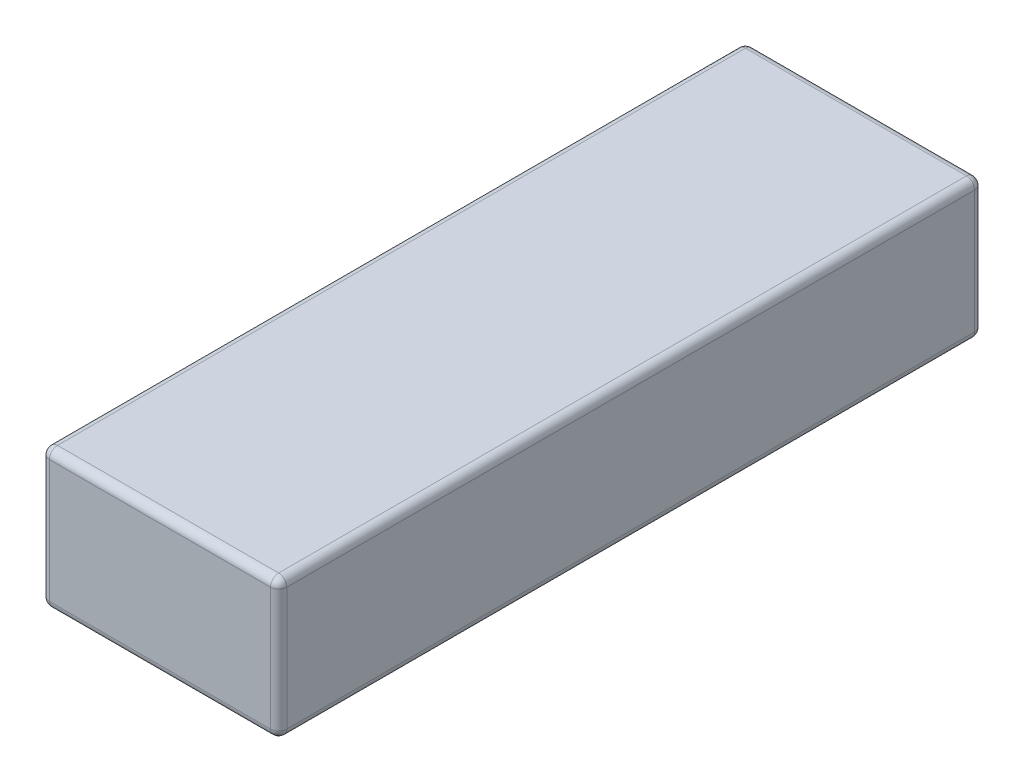
ISO-10303-21;
HEADER;
FILE_DESCRIPTION(('STEP AP214'),'2;1');
FILE_NAME('part.step','',(''),(''),'','','');
FILE_SCHEMA(('AUTOMOTIVE_DESIGN { 1 0 10303 214 1 1 1 1 }'));
ENDSEC;
DATA;
#1=APPLICATION_CONTEXT('core data for automotive mechanical design processes');
#2=APPLICATION_PROTOCOL_DEFINITION('international standard','automotive_design',2000,#1);
#3=PRODUCT_CONTEXT('',#1,'mechanical');
#4=PRODUCT('Part','Part','',(#3));
#5=PRODUCT_RELATED_PRODUCT_CATEGORY('part','',(#4));
#6=PRODUCT_DEFINITION_FORMATION('','',#4);
#7=PRODUCT_DEFINITION_CONTEXT('part definition',#1,'design');
#8=PRODUCT_DEFINITION('design','',#6,#7);
#9=PRODUCT_DEFINITION_SHAPE('','',#8);
#10=(LENGTH_UNIT() NAMED_UNIT(*) SI_UNIT(.MILLI.,.METRE.));
#11=(NAMED_UNIT(*) PLANE_ANGLE_UNIT() SI_UNIT($,.RADIAN.));
#12=(NAMED_UNIT(*) SI_UNIT($,.STERADIAN.) SOLID_ANGLE_UNIT());
#13=UNCERTAINTY_MEASURE_WITH_UNIT(LENGTH_MEASURE(1.E-05),#10,'distance_accuracy_value','');
#14=(GEOMETRIC_REPRESENTATION_CONTEXT(3) GLOBAL_UNCERTAINTY_ASSIGNED_CONTEXT((#13)) GLOBAL_UNIT_ASSIGNED_CONTEXT((#10,
#11,#12)) REPRESENTATION_CONTEXT('',''));
#15=CARTESIAN_POINT('',(0.,0.,0.));
#16=DIRECTION('',(0.,0.,1.));
#17=DIRECTION('',(1.,0.,0.));
#18=AXIS2_PLACEMENT_3D('',#15,#16,#17);
#19=CARTESIAN_POINT('',(14.5,-8.5,86.));
#20=DIRECTION('',(-1.,0.,0.));
#21=DIRECTION('',(0.,0.,1.));
#22=AXIS2_PLACEMENT_3D('',#19,#20,#21);
#23=PLANE('',#22);
#24=DIRECTION('',(0.,0.,-1.));
#25=VECTOR('',#24,1.);
#26=CARTESIAN_POINT('',(14.5,7.5,86.));
#27=LINE('',#26,#25);
#28=CARTESIAN_POINT('',(14.5,7.5,1.));
#29=VERTEX_POINT('',#28);
#30=CARTESIAN_POINT('',(14.5,7.5,85.));
#31=VERTEX_POINT('',#30);
#32=EDGE_CURVE('E192',#29,#31,#27,.F.);
#33=ORIENTED_EDGE('',*,*,#32,.T.);
#34=DIRECTION('',(0.,1.,0.));
#35=VECTOR('',#34,1.);
#36=CARTESIAN_POINT('',(14.5,-8.5,85.));
#37=LINE('',#36,#35);
#38=CARTESIAN_POINT('',(14.5,-7.5,85.));
#39=VERTEX_POINT('',#38);
#40=EDGE_CURVE('E199',#31,#39,#37,.F.);
#41=ORIENTED_EDGE('',*,*,#40,.T.);
#42=DIRECTION('',(0.,0.,-1.));
#43=VECTOR('',#42,1.);
#44=CARTESIAN_POINT('',(14.5,-7.5,86.));
#45=LINE('',#44,#43);
#46=CARTESIAN_POINT('',(14.5,-7.5,1.));
#47=VERTEX_POINT('',#46);
#48=EDGE_CURVE('E195',#39,#47,#45,.T.);
#49=ORIENTED_EDGE('',*,*,#48,.T.);
#50=DIRECTION('',(0.,1.,0.));
#51=VECTOR('',#50,1.);
#52=CARTESIAN_POINT('',(14.5,8.5,1.));
#53=LINE('',#52,#51);
#54=EDGE_CURVE('E189',#47,#29,#53,.T.);
#55=ORIENTED_EDGE('',*,*,#54,.T.);
#56=EDGE_LOOP('',(#33,#41,#49,#55));
#57=FACE_BOUND('',#56,.T.);
#58=ADVANCED_FACE('F44',(#57),#23,.F.);
#59=CARTESIAN_POINT('',(-14.5,8.5,86.));
#60=DIRECTION('',(0.,-1.,0.));
#61=DIRECTION('',(0.,0.,-1.));
#62=AXIS2_PLACEMENT_3D('',#59,#60,#61);
#63=PLANE('',#62);
#64=DIRECTION('',(-1.,0.,0.));
#65=VECTOR('',#64,1.);
#66=CARTESIAN_POINT('',(-14.5,8.5,85.));
#67=LINE('',#66,#65);
#68=CARTESIAN_POINT('',(-13.5,8.5,85.));
#69=VERTEX_POINT('',#68);
#70=CARTESIAN_POINT('',(13.5,8.5,85.));
#71=VERTEX_POINT('',#70);
#72=EDGE_CURVE('E208',#69,#71,#67,.F.);
#73=ORIENTED_EDGE('',*,*,#72,.T.);
#74=DIRECTION('',(0.,0.,-1.));
#75=VECTOR('',#74,1.);
#76=CARTESIAN_POINT('',(13.5,8.5,86.));
#77=LINE('',#76,#75);
#78=CARTESIAN_POINT('',(13.5,8.5,1.));
#79=VERTEX_POINT('',#78);
#80=EDGE_CURVE('E211',#71,#79,#77,.T.);
#81=ORIENTED_EDGE('',*,*,#80,.T.);
#82=DIRECTION('',(-1.,0.,0.));
#83=VECTOR('',#82,1.);
#84=CARTESIAN_POINT('',(-14.5,8.5,1.));
#85=LINE('',#84,#83);
#86=CARTESIAN_POINT('',(-13.5,8.5,1.));
#87=VERTEX_POINT('',#86);
#88=EDGE_CURVE('E205',#79,#87,#85,.T.);
#89=ORIENTED_EDGE('',*,*,#88,.T.);
#90=DIRECTION('',(0.,0.,-1.));
#91=VECTOR('',#90,1.);
#92=CARTESIAN_POINT('',(-13.5,8.5,86.));
#93=LINE('',#92,#91);
#94=EDGE_CURVE('E202',#87,#69,#93,.F.);
#95=ORIENTED_EDGE('',*,*,#94,.T.);
#96=EDGE_LOOP('',(#73,#81,#89,#95));
#97=FACE_BOUND('',#96,.T.);
#98=ADVANCED_FACE('F353',(#97),#63,.F.);
#99=CARTESIAN_POINT('',(-14.5,-8.5,86.));
#100=DIRECTION('',(1.,0.,0.));
#101=DIRECTION('',(0.,0.,-1.));
#102=AXIS2_PLACEMENT_3D('',#99,#100,#101);
#103=PLANE('',#102);
#104=DIRECTION('',(0.,-1.,0.));
#105=VECTOR('',#104,1.);
#106=CARTESIAN_POINT('',(-14.5,-8.5,1.));
#107=LINE('',#106,#105);
#108=CARTESIAN_POINT('',(-14.5,7.5,1.));
#109=VERTEX_POINT('',#108);
#110=CARTESIAN_POINT('',(-14.5,-7.5,1.));
#111=VERTEX_POINT('',#110);
#112=EDGE_CURVE('E181',#109,#111,#107,.T.);
#113=ORIENTED_EDGE('',*,*,#112,.T.);
#114=DIRECTION('',(0.,0.,-1.));
#115=VECTOR('',#114,1.);
#116=CARTESIAN_POINT('',(-14.5,-7.5,86.));
#117=LINE('',#116,#115);
#118=CARTESIAN_POINT('',(-14.5,-7.5,85.));
#119=VERTEX_POINT('',#118);
#120=EDGE_CURVE('E140',#111,#119,#117,.F.);
#121=ORIENTED_EDGE('',*,*,#120,.T.);
#122=DIRECTION('',(0.,-1.,0.));
#123=VECTOR('',#122,1.);
#124=CARTESIAN_POINT('',(-14.5,-8.5,85.));
#125=LINE('',#124,#123);
#126=CARTESIAN_POINT('',(-14.5,7.5,85.));
#127=VERTEX_POINT('',#126);
#128=EDGE_CURVE('E184',#119,#127,#125,.F.);
#129=ORIENTED_EDGE('',*,*,#128,.T.);
#130=DIRECTION('',(0.,0.,-1.));
#131=VECTOR('',#130,1.);
#132=CARTESIAN_POINT('',(-14.5,7.5,86.));
#133=LINE('',#132,#131);
#134=EDGE_CURVE('E175',#127,#109,#133,.T.);
#135=ORIENTED_EDGE('',*,*,#134,.T.);
#136=EDGE_LOOP('',(#113,#121,#129,#135));
#137=FACE_BOUND('',#136,.T.);
#138=ADVANCED_FACE('F369',(#137),#103,.F.);
#139=CARTESIAN_POINT('',(-14.5,-8.5,86.));
#140=DIRECTION('',(0.,1.,0.));
#141=DIRECTION('',(0.,0.,1.));
#142=AXIS2_PLACEMENT_3D('',#139,#140,#141);
#143=PLANE('',#142);
#144=DIRECTION('',(0.,0.,-1.));
#145=VECTOR('',#144,1.);
#146=CARTESIAN_POINT('',(13.5,-8.5,86.));
#147=LINE('',#146,#145);
#148=CARTESIAN_POINT('',(13.5,-8.5,1.));
#149=VERTEX_POINT('',#148);
#150=CARTESIAN_POINT('',(13.5,-8.5,85.));
#151=VERTEX_POINT('',#150);
#152=EDGE_CURVE('E164',#149,#151,#147,.F.);
#153=ORIENTED_EDGE('',*,*,#152,.T.);
#154=DIRECTION('',(1.,0.,0.));
#155=VECTOR('',#154,1.);
#156=CARTESIAN_POINT('',(-14.5,-8.5,85.));
#157=LINE('',#156,#155);
#158=CARTESIAN_POINT('',(-13.5,-8.5,85.));
#159=VERTEX_POINT('',#158);
#160=EDGE_CURVE('E168',#151,#159,#157,.F.);
#161=ORIENTED_EDGE('',*,*,#160,.T.);
#162=DIRECTION('',(0.,0.,-1.));
#163=VECTOR('',#162,1.);
#164=CARTESIAN_POINT('',(-13.5,-8.5,86.));
#165=LINE('',#164,#163);
#166=CARTESIAN_POINT('',(-13.5,-8.5,1.));
#167=VERTEX_POINT('',#166);
#168=EDGE_CURVE('E138',#159,#167,#165,.T.);
#169=ORIENTED_EDGE('',*,*,#168,.T.);
#170=DIRECTION('',(1.,0.,0.));
#171=VECTOR('',#170,1.);
#172=CARTESIAN_POINT('',(14.5,-8.5,1.));
#173=LINE('',#172,#171);
#174=EDGE_CURVE('E157',#167,#149,#173,.T.);
#175=ORIENTED_EDGE('',*,*,#174,.T.);
#176=EDGE_LOOP('',(#153,#161,#169,#175));
#177=FACE_BOUND('',#176,.T.);
#178=ADVANCED_FACE('F166',(#177),#143,.F.);
#179=CARTESIAN_POINT('',(0.,0.,86.));
#180=DIRECTION('',(0.,0.,-1.));
#181=DIRECTION('',(-1.,0.,0.));
#182=AXIS2_PLACEMENT_3D('',#179,#180,#181);
#183=PLANE('',#182);
#184=DIRECTION('',(0.,-1.,0.));
#185=VECTOR('',#184,1.);
#186=CARTESIAN_POINT('',(-13.5,0.,86.));
#187=LINE('',#186,#185);
#188=CARTESIAN_POINT('',(-13.5,7.5,86.));
#189=VERTEX_POINT('',#188);
#190=CARTESIAN_POINT('',(-13.5,-7.5,86.));
#191=VERTEX_POINT('',#190);
#192=EDGE_CURVE('E221',#189,#191,#187,.T.);
#193=ORIENTED_EDGE('',*,*,#192,.T.);
#194=DIRECTION('',(1.,0.,0.));
#195=VECTOR('',#194,1.);
#196=CARTESIAN_POINT('',(0.,-7.5,86.));
#197=LINE('',#196,#195);
#198=CARTESIAN_POINT('',(13.5,-7.5,86.));
#199=VERTEX_POINT('',#198);
#200=EDGE_CURVE('E224',#191,#199,#197,.T.);
#201=ORIENTED_EDGE('',*,*,#200,.T.);
#202=DIRECTION('',(0.,1.,0.));
#203=VECTOR('',#202,1.);
#204=CARTESIAN_POINT('',(13.5,0.,86.));
#205=LINE('',#204,#203);
#206=CARTESIAN_POINT('',(13.5,7.5,86.));
#207=VERTEX_POINT('',#206);
#208=EDGE_CURVE('E215',#199,#207,#205,.T.);
#209=ORIENTED_EDGE('',*,*,#208,.T.);
#210=DIRECTION('',(-1.,0.,0.));
#211=VECTOR('',#210,1.);
#212=CARTESIAN_POINT('',(0.,7.5,86.));
#213=LINE('',#212,#211);
#214=EDGE_CURVE('E218',#207,#189,#213,.T.);
#215=ORIENTED_EDGE('',*,*,#214,.T.);
#216=EDGE_LOOP('',(#193,#201,#209,#215));
#217=FACE_BOUND('',#216,.T.);
#218=ADVANCED_FACE('F333',(#217),#183,.F.);
#219=CARTESIAN_POINT('',(0.,0.,0.));
#220=DIRECTION('',(0.,0.,-1.));
#221=DIRECTION('',(-1.,0.,0.));
#222=AXIS2_PLACEMENT_3D('',#219,#220,#221);
#223=PLANE('',#222);
#224=DIRECTION('',(0.,-1.,0.));
#225=VECTOR('',#224,1.);
#226=CARTESIAN_POINT('',(-13.5,8.5,0.));
#227=LINE('',#226,#225);
#228=CARTESIAN_POINT('',(-13.5,-7.5,0.));
#229=VERTEX_POINT('',#228);
#230=CARTESIAN_POINT('',(-13.5,7.5,0.));
#231=VERTEX_POINT('',#230);
#232=EDGE_CURVE('E54',#229,#231,#227,.F.);
#233=ORIENTED_EDGE('',*,*,#232,.T.);
#234=DIRECTION('',(-1.,0.,0.));
#235=VECTOR('',#234,1.);
#236=CARTESIAN_POINT('',(14.5,7.5,0.));
#237=LINE('',#236,#235);
#238=CARTESIAN_POINT('',(13.5,7.5,0.));
#239=VERTEX_POINT('',#238);
#240=EDGE_CURVE('E11',#231,#239,#237,.F.);
#241=ORIENTED_EDGE('',*,*,#240,.T.);
#242=DIRECTION('',(0.,1.,0.));
#243=VECTOR('',#242,1.);
#244=CARTESIAN_POINT('',(13.5,-8.5,0.));
#245=LINE('',#244,#243);
#246=CARTESIAN_POINT('',(13.5,-7.5,0.));
#247=VERTEX_POINT('',#246);
#248=EDGE_CURVE('E228',#239,#247,#245,.F.);
#249=ORIENTED_EDGE('',*,*,#248,.T.);
#250=DIRECTION('',(1.,0.,0.));
#251=VECTOR('',#250,1.);
#252=CARTESIAN_POINT('',(-14.5,-7.5,0.));
#253=LINE('',#252,#251);
#254=EDGE_CURVE('E65',#247,#229,#253,.F.);
#255=ORIENTED_EDGE('',*,*,#254,.T.);
#256=EDGE_LOOP('',(#233,#241,#249,#255));
#257=FACE_BOUND('',#256,.T.);
#258=ADVANCED_FACE('F578',(#257),#223,.T.);
#259=CARTESIAN_POINT('',(13.5,7.5,86.));
#260=DIRECTION('',(0.,0.,-1.));
#261=DIRECTION('',(-1.,0.,0.));
#262=AXIS2_PLACEMENT_3D('',#259,#260,#261);
#263=CYLINDRICAL_SURFACE('',#262,1.);
#264=CARTESIAN_POINT('',(13.5,7.5,85.));
#265=DIRECTION('',(0.,0.,1.));
#266=DIRECTION('',(1.,0.,0.));
#267=AXIS2_PLACEMENT_3D('',#264,#265,#266);
#268=CIRCLE('',#267,1.);
#269=EDGE_CURVE('E48',#31,#71,#268,.T.);
#270=ORIENTED_EDGE('',*,*,#269,.F.);
#271=ORIENTED_EDGE('',*,*,#32,.F.);
#272=CARTESIAN_POINT('',(13.5,7.5,1.));
#273=DIRECTION('',(0.,0.,-1.));
#274=DIRECTION('',(-1.,0.,0.));
#275=AXIS2_PLACEMENT_3D('',#272,#273,#274);
#276=CIRCLE('',#275,1.);
#277=EDGE_CURVE('E305',#79,#29,#276,.T.);
#278=ORIENTED_EDGE('',*,*,#277,.F.);
#279=ORIENTED_EDGE('',*,*,#80,.F.);
#280=EDGE_LOOP('',(#270,#271,#278,#279));
#281=FACE_BOUND('',#280,.T.);
#282=ADVANCED_FACE('F46',(#281),#263,.T.);
#283=CARTESIAN_POINT('',(13.5,7.5,85.));
#284=DIRECTION('',(0.,1.,0.));
#285=DIRECTION('',(-1.,0.,0.));
#286=AXIS2_PLACEMENT_3D('',#283,#284,#285);
#287=SPHERICAL_SURFACE('',#286,1.);
#288=CARTESIAN_POINT('',(13.5,7.5,85.));
#289=DIRECTION('',(0.,1.,0.));
#290=DIRECTION('',(0.,0.,1.));
#291=AXIS2_PLACEMENT_3D('',#288,#289,#290);
#292=CIRCLE('',#291,1.);
#293=EDGE_CURVE('E298',#31,#207,#292,.F.);
#294=ORIENTED_EDGE('',*,*,#293,.F.);
#295=ORIENTED_EDGE('',*,*,#269,.T.);
#296=CARTESIAN_POINT('',(13.5,7.5,85.));
#297=DIRECTION('',(1.,0.,0.));
#298=DIRECTION('',(0.,0.,-1.));
#299=AXIS2_PLACEMENT_3D('',#296,#297,#298);
#300=CIRCLE('',#299,1.);
#301=EDGE_CURVE('E302',#207,#71,#300,.F.);
#302=ORIENTED_EDGE('',*,*,#301,.F.);
#303=EDGE_LOOP('',(#294,#295,#302));
#304=FACE_BOUND('',#303,.T.);
#305=ADVANCED_FACE('F320',(#304),#287,.T.);
#306=CARTESIAN_POINT('',(13.5,7.5,1.));
#307=DIRECTION('',(1.,0.,0.));
#308=DIRECTION('',(0.,0.,-1.));
#309=AXIS2_PLACEMENT_3D('',#306,#307,#308);
#310=SPHERICAL_SURFACE('',#309,1.);
#311=CARTESIAN_POINT('',(13.5,7.5,1.));
#312=DIRECTION('',(1.,0.,0.));
#313=DIRECTION('',(0.,1.,0.));
#314=AXIS2_PLACEMENT_3D('',#311,#312,#313);
#315=CIRCLE('',#314,1.);
#316=EDGE_CURVE('E290',#79,#239,#315,.F.);
#317=ORIENTED_EDGE('',*,*,#316,.F.);
#318=ORIENTED_EDGE('',*,*,#277,.T.);
#319=CARTESIAN_POINT('',(13.5,7.5,1.));
#320=DIRECTION('',(0.,1.,0.));
#321=DIRECTION('',(0.,0.,1.));
#322=AXIS2_PLACEMENT_3D('',#319,#320,#321);
#323=CIRCLE('',#322,1.);
#324=EDGE_CURVE('E294',#239,#29,#323,.F.);
#325=ORIENTED_EDGE('',*,*,#324,.F.);
#326=EDGE_LOOP('',(#317,#318,#325));
#327=FACE_BOUND('',#326,.T.);
#328=ADVANCED_FACE('F551',(#327),#310,.T.);
#329=CARTESIAN_POINT('',(0.,7.5,85.));
#330=DIRECTION('',(-1.,0.,0.));
#331=DIRECTION('',(0.,0.,1.));
#332=AXIS2_PLACEMENT_3D('',#329,#330,#331);
#333=CYLINDRICAL_SURFACE('',#332,1.);
#334=ORIENTED_EDGE('',*,*,#301,.T.);
#335=ORIENTED_EDGE('',*,*,#72,.F.);
#336=CARTESIAN_POINT('',(-13.5,7.5,85.));
#337=DIRECTION('',(-1.,0.,0.));
#338=DIRECTION('',(0.,0.,1.));
#339=AXIS2_PLACEMENT_3D('',#336,#337,#338);
#340=CIRCLE('',#339,1.);
#341=EDGE_CURVE('E282',#189,#69,#340,.T.);
#342=ORIENTED_EDGE('',*,*,#341,.F.);
#343=ORIENTED_EDGE('',*,*,#214,.F.);
#344=EDGE_LOOP('',(#334,#335,#342,#343));
#345=FACE_BOUND('',#344,.T.);
#346=ADVANCED_FACE('F328',(#345),#333,.T.);
#347=CARTESIAN_POINT('',(13.5,0.,85.));
#348=DIRECTION('',(0.,1.,0.));
#349=DIRECTION('',(0.,0.,1.));
#350=AXIS2_PLACEMENT_3D('',#347,#348,#349);
#351=CYLINDRICAL_SURFACE('',#350,1.);
#352=ORIENTED_EDGE('',*,*,#293,.T.);
#353=ORIENTED_EDGE('',*,*,#208,.F.);
#354=CARTESIAN_POINT('',(13.5,-7.5,85.));
#355=DIRECTION('',(0.,-1.,0.));
#356=DIRECTION('',(0.,0.,-1.));
#357=AXIS2_PLACEMENT_3D('',#354,#355,#356);
#358=CIRCLE('',#357,1.);
#359=EDGE_CURVE('E278',#39,#199,#358,.T.);
#360=ORIENTED_EDGE('',*,*,#359,.F.);
#361=ORIENTED_EDGE('',*,*,#40,.F.);
#362=EDGE_LOOP('',(#352,#353,#360,#361));
#363=FACE_BOUND('',#362,.T.);
#364=ADVANCED_FACE('F339',(#363),#351,.T.);
#365=CARTESIAN_POINT('',(13.5,-7.5,86.));
#366=DIRECTION('',(0.,0.,-1.));
#367=DIRECTION('',(-1.,0.,0.));
#368=AXIS2_PLACEMENT_3D('',#365,#366,#367);
#369=CYLINDRICAL_SURFACE('',#368,1.);
#370=CARTESIAN_POINT('',(13.5,-7.5,1.));
#371=DIRECTION('',(0.,0.,-1.));
#372=DIRECTION('',(-1.,0.,0.));
#373=AXIS2_PLACEMENT_3D('',#370,#371,#372);
#374=CIRCLE('',#373,1.);
#375=EDGE_CURVE('E270',#47,#149,#374,.T.);
#376=ORIENTED_EDGE('',*,*,#375,.F.);
#377=ORIENTED_EDGE('',*,*,#48,.F.);
#378=CARTESIAN_POINT('',(13.5,-7.5,85.));
#379=DIRECTION('',(0.,0.,1.));
#380=DIRECTION('',(1.,0.,0.));
#381=AXIS2_PLACEMENT_3D('',#378,#379,#380);
#382=CIRCLE('',#381,1.);
#383=EDGE_CURVE('E274',#151,#39,#382,.T.);
#384=ORIENTED_EDGE('',*,*,#383,.F.);
#385=ORIENTED_EDGE('',*,*,#152,.F.);
#386=EDGE_LOOP('',(#376,#377,#384,#385));
#387=FACE_BOUND('',#386,.T.);
#388=ADVANCED_FACE('F345',(#387),#369,.T.);
#389=CARTESIAN_POINT('',(13.5,-8.5,1.));
#390=DIRECTION('',(0.,-1.,0.));
#391=DIRECTION('',(0.,0.,-1.));
#392=AXIS2_PLACEMENT_3D('',#389,#390,#391);
#393=CYLINDRICAL_SURFACE('',#392,1.);
#394=ORIENTED_EDGE('',*,*,#324,.T.);
#395=ORIENTED_EDGE('',*,*,#54,.F.);
#396=CARTESIAN_POINT('',(13.5,-7.5,1.));
#397=DIRECTION('',(0.,-1.,0.));
#398=DIRECTION('',(0.,0.,-1.));
#399=AXIS2_PLACEMENT_3D('',#396,#397,#398);
#400=CIRCLE('',#399,1.);
#401=EDGE_CURVE('E267',#247,#47,#400,.T.);
#402=ORIENTED_EDGE('',*,*,#401,.F.);
#403=ORIENTED_EDGE('',*,*,#248,.F.);
#404=EDGE_LOOP('',(#394,#395,#402,#403));
#405=FACE_BOUND('',#404,.T.);
#406=ADVANCED_FACE('F351',(#405),#393,.T.);
#407=CARTESIAN_POINT('',(-14.5,7.5,1.));
#408=DIRECTION('',(1.,0.,0.));
#409=DIRECTION('',(0.,0.,-1.));
#410=AXIS2_PLACEMENT_3D('',#407,#408,#409);
#411=CYLINDRICAL_SURFACE('',#410,1.);
#412=ORIENTED_EDGE('',*,*,#316,.T.);
#413=ORIENTED_EDGE('',*,*,#240,.F.);
#414=CARTESIAN_POINT('',(-13.5,7.5,1.));
#415=DIRECTION('',(-1.,0.,0.));
#416=DIRECTION('',(0.,0.,1.));
#417=AXIS2_PLACEMENT_3D('',#414,#415,#416);
#418=CIRCLE('',#417,1.);
#419=EDGE_CURVE('E263',#87,#231,#418,.T.);
#420=ORIENTED_EDGE('',*,*,#419,.F.);
#421=ORIENTED_EDGE('',*,*,#88,.F.);
#422=EDGE_LOOP('',(#412,#413,#420,#421));
#423=FACE_BOUND('',#422,.T.);
#424=ADVANCED_FACE('F362',(#423),#411,.T.);
#425=CARTESIAN_POINT('',(-13.5,7.5,86.));
#426=DIRECTION('',(0.,0.,-1.));
#427=DIRECTION('',(-1.,0.,0.));
#428=AXIS2_PLACEMENT_3D('',#425,#426,#427);
#429=CYLINDRICAL_SURFACE('',#428,1.);
#430=CARTESIAN_POINT('',(-13.5,7.5,85.));
#431=DIRECTION('',(0.,0.,1.));
#432=DIRECTION('',(1.,0.,0.));
#433=AXIS2_PLACEMENT_3D('',#430,#431,#432);
#434=CIRCLE('',#433,1.);
#435=EDGE_CURVE('E286',#69,#127,#434,.T.);
#436=ORIENTED_EDGE('',*,*,#435,.F.);
#437=ORIENTED_EDGE('',*,*,#94,.F.);
#438=CARTESIAN_POINT('',(-13.5,7.5,1.));
#439=DIRECTION('',(0.,0.,-1.));
#440=DIRECTION('',(-1.,0.,0.));
#441=AXIS2_PLACEMENT_3D('',#438,#439,#440);
#442=CIRCLE('',#441,1.);
#443=EDGE_CURVE('E259',#109,#87,#442,.T.);
#444=ORIENTED_EDGE('',*,*,#443,.F.);
#445=ORIENTED_EDGE('',*,*,#134,.F.);
#446=EDGE_LOOP('',(#436,#437,#444,#445));
#447=FACE_BOUND('',#446,.T.);
#448=ADVANCED_FACE('F358',(#447),#429,.T.);
#449=CARTESIAN_POINT('',(-13.5,7.5,85.));
#450=DIRECTION('',(0.,1.,0.));
#451=DIRECTION('',(0.,0.,1.));
#452=AXIS2_PLACEMENT_3D('',#449,#450,#451);
#453=SPHERICAL_SURFACE('',#452,1.);
#454=ORIENTED_EDGE('',*,*,#341,.T.);
#455=ORIENTED_EDGE('',*,*,#435,.T.);
#456=CARTESIAN_POINT('',(-13.5,7.5,85.));
#457=DIRECTION('',(0.,1.,0.));
#458=DIRECTION('',(0.,0.,1.));
#459=AXIS2_PLACEMENT_3D('',#456,#457,#458);
#460=CIRCLE('',#459,1.);
#461=EDGE_CURVE('E255',#189,#127,#460,.F.);
#462=ORIENTED_EDGE('',*,*,#461,.F.);
#463=EDGE_LOOP('',(#454,#455,#462));
#464=FACE_BOUND('',#463,.T.);
#465=ADVANCED_FACE('F372',(#464),#453,.T.);
#466=CARTESIAN_POINT('',(13.5,-7.5,85.));
#467=DIRECTION('',(1.,0.,0.));
#468=DIRECTION('',(0.,0.,-1.));
#469=AXIS2_PLACEMENT_3D('',#466,#467,#468);
#470=SPHERICAL_SURFACE('',#469,1.);
#471=ORIENTED_EDGE('',*,*,#383,.T.);
#472=ORIENTED_EDGE('',*,*,#359,.T.);
#473=CARTESIAN_POINT('',(13.5,-7.5,85.));
#474=DIRECTION('',(1.,0.,0.));
#475=DIRECTION('',(0.,0.,-1.));
#476=AXIS2_PLACEMENT_3D('',#473,#474,#475);
#477=CIRCLE('',#476,1.);
#478=EDGE_CURVE('E252',#151,#199,#477,.F.);
#479=ORIENTED_EDGE('',*,*,#478,.F.);
#480=EDGE_LOOP('',(#471,#472,#479));
#481=FACE_BOUND('',#480,.T.);
#482=ADVANCED_FACE('F382',(#481),#470,.T.);
#483=CARTESIAN_POINT('',(13.5,-7.5,1.));
#484=DIRECTION('',(1.,0.,0.));
#485=DIRECTION('',(0.,0.,-1.));
#486=AXIS2_PLACEMENT_3D('',#483,#484,#485);
#487=SPHERICAL_SURFACE('',#486,1.);
#488=ORIENTED_EDGE('',*,*,#401,.T.);
#489=ORIENTED_EDGE('',*,*,#375,.T.);
#490=CARTESIAN_POINT('',(13.5,-7.5,1.));
#491=DIRECTION('',(1.,0.,0.));
#492=DIRECTION('',(0.,0.,-1.));
#493=AXIS2_PLACEMENT_3D('',#490,#491,#492);
#494=CIRCLE('',#493,1.);
#495=EDGE_CURVE('E160',#247,#149,#494,.F.);
#496=ORIENTED_EDGE('',*,*,#495,.F.);
#497=EDGE_LOOP('',(#488,#489,#496));
#498=FACE_BOUND('',#497,.T.);
#499=ADVANCED_FACE('F384',(#498),#487,.T.);
#500=CARTESIAN_POINT('',(-13.5,7.5,1.));
#501=DIRECTION('',(0.,1.,0.));
#502=DIRECTION('',(0.,0.,1.));
#503=AXIS2_PLACEMENT_3D('',#500,#501,#502);
#504=SPHERICAL_SURFACE('',#503,1.);
#505=ORIENTED_EDGE('',*,*,#443,.T.);
#506=ORIENTED_EDGE('',*,*,#419,.T.);
#507=CARTESIAN_POINT('',(-13.5,7.5,1.));
#508=DIRECTION('',(0.,1.,0.));
#509=DIRECTION('',(-1.,0.,0.));
#510=AXIS2_PLACEMENT_3D('',#507,#508,#509);
#511=CIRCLE('',#510,1.);
#512=EDGE_CURVE('E246',#109,#231,#511,.F.);
#513=ORIENTED_EDGE('',*,*,#512,.F.);
#514=EDGE_LOOP('',(#505,#506,#513));
#515=FACE_BOUND('',#514,.T.);
#516=ADVANCED_FACE('F364',(#515),#504,.T.);
#517=CARTESIAN_POINT('',(-13.5,0.,85.));
#518=DIRECTION('',(0.,-1.,0.));
#519=DIRECTION('',(0.,0.,-1.));
#520=AXIS2_PLACEMENT_3D('',#517,#518,#519);
#521=CYLINDRICAL_SURFACE('',#520,1.);
#522=ORIENTED_EDGE('',*,*,#461,.T.);
#523=ORIENTED_EDGE('',*,*,#128,.F.);
#524=CARTESIAN_POINT('',(-13.5,-7.5,85.));
#525=DIRECTION('',(0.,-1.,0.));
#526=DIRECTION('',(0.,0.,-1.));
#527=AXIS2_PLACEMENT_3D('',#524,#525,#526);
#528=CIRCLE('',#527,1.);
#529=EDGE_CURVE('E242',#191,#119,#528,.T.);
#530=ORIENTED_EDGE('',*,*,#529,.F.);
#531=ORIENTED_EDGE('',*,*,#192,.F.);
#532=EDGE_LOOP('',(#522,#523,#530,#531));
#533=FACE_BOUND('',#532,.T.);
#534=ADVANCED_FACE('F374',(#533),#521,.T.);
#535=CARTESIAN_POINT('',(0.,-7.5,85.));
#536=DIRECTION('',(1.,0.,0.));
#537=DIRECTION('',(0.,0.,-1.));
#538=AXIS2_PLACEMENT_3D('',#535,#536,#537);
#539=CYLINDRICAL_SURFACE('',#538,1.);
#540=ORIENTED_EDGE('',*,*,#478,.T.);
#541=ORIENTED_EDGE('',*,*,#200,.F.);
#542=CARTESIAN_POINT('',(-13.5,-7.5,85.));
#543=DIRECTION('',(-1.,0.,0.));
#544=DIRECTION('',(0.,0.,1.));
#545=AXIS2_PLACEMENT_3D('',#542,#543,#544);
#546=CIRCLE('',#545,1.);
#547=EDGE_CURVE('E154',#159,#191,#546,.T.);
#548=ORIENTED_EDGE('',*,*,#547,.F.);
#549=ORIENTED_EDGE('',*,*,#160,.F.);
#550=EDGE_LOOP('',(#540,#541,#548,#549));
#551=FACE_BOUND('',#550,.T.);
#552=ADVANCED_FACE('F380',(#551),#539,.T.);
#553=CARTESIAN_POINT('',(-14.5,-7.5,1.));
#554=DIRECTION('',(-1.,0.,0.));
#555=DIRECTION('',(0.,0.,1.));
#556=AXIS2_PLACEMENT_3D('',#553,#554,#555);
#557=CYLINDRICAL_SURFACE('',#556,1.);
#558=ORIENTED_EDGE('',*,*,#495,.T.);
#559=ORIENTED_EDGE('',*,*,#174,.F.);
#560=CARTESIAN_POINT('',(-13.5,-7.5,1.));
#561=DIRECTION('',(-1.,0.,0.));
#562=DIRECTION('',(0.,0.,1.));
#563=AXIS2_PLACEMENT_3D('',#560,#561,#562);
#564=CIRCLE('',#563,1.);
#565=EDGE_CURVE('E147',#229,#167,#564,.T.);
#566=ORIENTED_EDGE('',*,*,#565,.F.);
#567=ORIENTED_EDGE('',*,*,#254,.F.);
#568=EDGE_LOOP('',(#558,#559,#566,#567));
#569=FACE_BOUND('',#568,.T.);
#570=ADVANCED_FACE('F158',(#569),#557,.T.);
#571=CARTESIAN_POINT('',(-13.5,-8.5,1.));
#572=DIRECTION('',(0.,1.,0.));
#573=DIRECTION('',(0.,0.,1.));
#574=AXIS2_PLACEMENT_3D('',#571,#572,#573);
#575=CYLINDRICAL_SURFACE('',#574,1.);
#576=ORIENTED_EDGE('',*,*,#512,.T.);
#577=ORIENTED_EDGE('',*,*,#232,.F.);
#578=CARTESIAN_POINT('',(-13.5,-7.5,1.));
#579=DIRECTION('',(0.,-1.,0.));
#580=DIRECTION('',(0.,0.,-1.));
#581=AXIS2_PLACEMENT_3D('',#578,#579,#580);
#582=CIRCLE('',#581,1.);
#583=EDGE_CURVE('E151',#111,#229,#582,.T.);
#584=ORIENTED_EDGE('',*,*,#583,.F.);
#585=ORIENTED_EDGE('',*,*,#112,.F.);
#586=EDGE_LOOP('',(#576,#577,#584,#585));
#587=FACE_BOUND('',#586,.T.);
#588=ADVANCED_FACE('F367',(#587),#575,.T.);
#589=CARTESIAN_POINT('',(-13.5,-7.5,85.));
#590=DIRECTION('',(0.,0.,1.));
#591=DIRECTION('',(1.,0.,0.));
#592=AXIS2_PLACEMENT_3D('',#589,#590,#591);
#593=SPHERICAL_SURFACE('',#592,1.);
#594=ORIENTED_EDGE('',*,*,#547,.T.);
#595=ORIENTED_EDGE('',*,*,#529,.T.);
#596=CARTESIAN_POINT('',(-13.5,-7.5,85.));
#597=DIRECTION('',(0.,0.,1.));
#598=DIRECTION('',(1.,0.,0.));
#599=AXIS2_PLACEMENT_3D('',#596,#597,#598);
#600=CIRCLE('',#599,1.);
#601=EDGE_CURVE('E144',#159,#119,#600,.F.);
#602=ORIENTED_EDGE('',*,*,#601,.F.);
#603=EDGE_LOOP('',(#594,#595,#602));
#604=FACE_BOUND('',#603,.T.);
#605=ADVANCED_FACE('F378',(#604),#593,.T.);
#606=CARTESIAN_POINT('',(-13.5,-7.5,1.));
#607=DIRECTION('',(0.,0.,-1.));
#608=DIRECTION('',(-1.,0.,0.));
#609=AXIS2_PLACEMENT_3D('',#606,#607,#608);
#610=SPHERICAL_SURFACE('',#609,1.);
#611=ORIENTED_EDGE('',*,*,#583,.T.);
#612=ORIENTED_EDGE('',*,*,#565,.T.);
#613=CARTESIAN_POINT('',(-13.5,-7.5,1.));
#614=DIRECTION('',(0.,0.,-1.));
#615=DIRECTION('',(-1.,0.,0.));
#616=AXIS2_PLACEMENT_3D('',#613,#614,#615);
#617=CIRCLE('',#616,1.);
#618=EDGE_CURVE('E134',#111,#167,#617,.F.);
#619=ORIENTED_EDGE('',*,*,#618,.F.);
#620=EDGE_LOOP('',(#611,#612,#619));
#621=FACE_BOUND('',#620,.T.);
#622=ADVANCED_FACE('F149',(#621),#610,.T.);
#623=CARTESIAN_POINT('',(-13.5,-7.5,86.));
#624=DIRECTION('',(0.,0.,-1.));
#625=DIRECTION('',(-1.,0.,0.));
#626=AXIS2_PLACEMENT_3D('',#623,#624,#625);
#627=CYLINDRICAL_SURFACE('',#626,1.);
#628=ORIENTED_EDGE('',*,*,#601,.T.);
#629=ORIENTED_EDGE('',*,*,#120,.F.);
#630=ORIENTED_EDGE('',*,*,#618,.T.);
#631=ORIENTED_EDGE('',*,*,#168,.F.);
#632=EDGE_LOOP('',(#628,#629,#630,#631));
#633=FACE_BOUND('',#632,.T.);
#634=ADVANCED_FACE('F136',(#633),#627,.T.);
#635=CLOSED_SHELL('',(#58,#98,#138,#178,#218,#258,#282,#305,#328,#346,#364,#388,#406,#424,#448,
#465,#482,#499,#516,#534,#552,#570,#588,#605,#622,#634));
#636=MANIFOLD_SOLID_BREP('B2',#635);
#637=ADVANCED_BREP_SHAPE_REPRESENTATION('',(#18,#636),#14);
#638=SHAPE_DEFINITION_REPRESENTATION(#9,#637);
ENDSEC;
END-ISO-10303-21;
